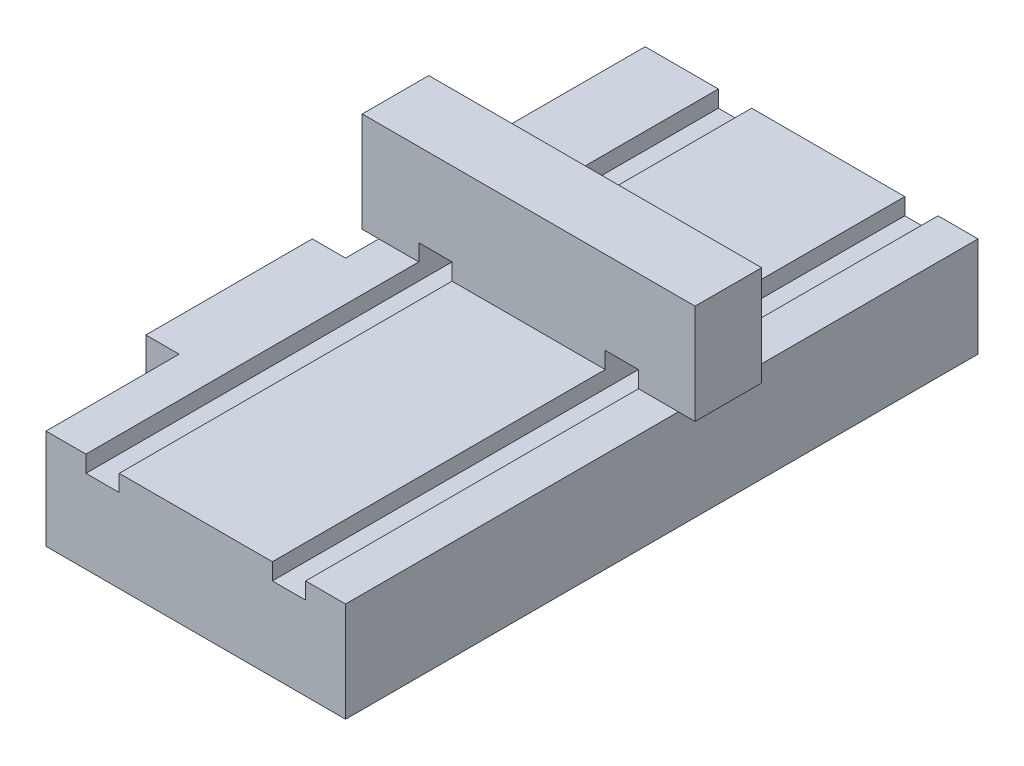
ISO-10303-21;
HEADER;
FILE_DESCRIPTION(('STEP AP214'),'2;1');
FILE_NAME('part.step','',(''),(''),'','','');
FILE_SCHEMA(('AUTOMOTIVE_DESIGN { 1 0 10303 214 1 1 1 1 }'));
ENDSEC;
DATA;
#1=APPLICATION_CONTEXT('core data for automotive mechanical design processes');
#2=APPLICATION_PROTOCOL_DEFINITION('international standard','automotive_design',2000,#1);
#3=PRODUCT_CONTEXT('',#1,'mechanical');
#4=PRODUCT('Part','Part','',(#3));
#5=PRODUCT_RELATED_PRODUCT_CATEGORY('part','',(#4));
#6=PRODUCT_DEFINITION_FORMATION('','',#4);
#7=PRODUCT_DEFINITION_CONTEXT('part definition',#1,'design');
#8=PRODUCT_DEFINITION('design','',#6,#7);
#9=PRODUCT_DEFINITION_SHAPE('','',#8);
#10=(LENGTH_UNIT() NAMED_UNIT(*) SI_UNIT(.MILLI.,.METRE.));
#11=(NAMED_UNIT(*) PLANE_ANGLE_UNIT() SI_UNIT($,.RADIAN.));
#12=(NAMED_UNIT(*) SI_UNIT($,.STERADIAN.) SOLID_ANGLE_UNIT());
#13=UNCERTAINTY_MEASURE_WITH_UNIT(LENGTH_MEASURE(1.E-05),#10,'distance_accuracy_value','');
#14=(GEOMETRIC_REPRESENTATION_CONTEXT(3) GLOBAL_UNCERTAINTY_ASSIGNED_CONTEXT((#13)) GLOBAL_UNIT_ASSIGNED_CONTEXT((#10,
#11,#12)) REPRESENTATION_CONTEXT('',''));
#15=CARTESIAN_POINT('',(0.,0.,0.));
#16=DIRECTION('',(0.,0.,1.));
#17=DIRECTION('',(1.,0.,0.));
#18=AXIS2_PLACEMENT_3D('',#15,#16,#17);
#19=CARTESIAN_POINT('',(100.,30.,0.));
#20=DIRECTION('',(-1.,0.,0.));
#21=DIRECTION('',(0.,0.,1.));
#22=AXIS2_PLACEMENT_3D('',#19,#20,#21);
#23=PLANE('',#22);
#24=DIRECTION('',(0.,0.,-1.));
#25=VECTOR('',#24,1.);
#26=CARTESIAN_POINT('',(100.,30.,-100.));
#27=LINE('',#26,#25);
#28=CARTESIAN_POINT('',(100.,30.,-100.));
#29=VERTEX_POINT('',#28);
#30=CARTESIAN_POINT('',(100.,30.,-120.));
#31=VERTEX_POINT('',#30);
#32=EDGE_CURVE('E71',#29,#31,#27,.T.);
#33=ORIENTED_EDGE('',*,*,#32,.F.);
#34=DIRECTION('',(0.,0.,-1.));
#35=VECTOR('',#34,1.);
#36=CARTESIAN_POINT('',(100.,30.,0.));
#37=LINE('',#36,#35);
#38=CARTESIAN_POINT('',(100.,30.,0.));
#39=VERTEX_POINT('',#38);
#40=EDGE_CURVE('E474',#39,#29,#37,.T.);
#41=ORIENTED_EDGE('',*,*,#40,.F.);
#42=DIRECTION('',(0.,-1.,0.));
#43=VECTOR('',#42,1.);
#44=CARTESIAN_POINT('',(100.,30.,0.));
#45=LINE('',#44,#43);
#46=CARTESIAN_POINT('',(100.,0.,0.));
#47=VERTEX_POINT('',#46);
#48=EDGE_CURVE('E568',#39,#47,#45,.T.);
#49=ORIENTED_EDGE('',*,*,#48,.T.);
#50=DIRECTION('',(0.,0.,-1.));
#51=VECTOR('',#50,1.);
#52=CARTESIAN_POINT('',(100.,0.,0.));
#53=LINE('',#52,#51);
#54=CARTESIAN_POINT('',(100.,0.,-190.));
#55=VERTEX_POINT('',#54);
#56=EDGE_CURVE('E514',#47,#55,#53,.T.);
#57=ORIENTED_EDGE('',*,*,#56,.T.);
#58=DIRECTION('',(0.,-1.,0.));
#59=VECTOR('',#58,1.);
#60=CARTESIAN_POINT('',(100.,30.,-190.));
#61=LINE('',#60,#59);
#62=CARTESIAN_POINT('',(100.,30.,-190.));
#63=VERTEX_POINT('',#62);
#64=EDGE_CURVE('E49',#63,#55,#61,.T.);
#65=ORIENTED_EDGE('',*,*,#64,.F.);
#66=EDGE_CURVE('E471',#31,#63,#37,.T.);
#67=ORIENTED_EDGE('',*,*,#66,.F.);
#68=EDGE_LOOP('',(#33,#41,#49,#57,#65,#67));
#69=FACE_BOUND('',#68,.T.);
#70=ADVANCED_FACE('F45',(#69),#23,.F.);
#71=CARTESIAN_POINT('',(10.,30.,-90.));
#72=DIRECTION('',(-1.,0.,0.));
#73=DIRECTION('',(0.,0.,1.));
#74=AXIS2_PLACEMENT_3D('',#71,#72,#73);
#75=PLANE('',#74);
#76=DIRECTION('',(0.,0.,-1.));
#77=VECTOR('',#76,1.);
#78=CARTESIAN_POINT('',(10.,30.,-90.));
#79=LINE('',#78,#77);
#80=CARTESIAN_POINT('',(10.,30.,-90.));
#81=VERTEX_POINT('',#80);
#82=CARTESIAN_POINT('',(10.,30.,-100.));
#83=VERTEX_POINT('',#82);
#84=EDGE_CURVE('E500',#81,#83,#79,.T.);
#85=ORIENTED_EDGE('',*,*,#84,.T.);
#86=DIRECTION('',(0.,0.,1.));
#87=VECTOR('',#86,1.);
#88=CARTESIAN_POINT('',(10.,30.,-120.));
#89=LINE('',#88,#87);
#90=CARTESIAN_POINT('',(10.,30.,-120.));
#91=VERTEX_POINT('',#90);
#92=EDGE_CURVE('E287',#91,#83,#89,.T.);
#93=ORIENTED_EDGE('',*,*,#92,.F.);
#94=CARTESIAN_POINT('',(10.,30.,-140.));
#95=VERTEX_POINT('',#94);
#96=EDGE_CURVE('E499',#91,#95,#79,.T.);
#97=ORIENTED_EDGE('',*,*,#96,.T.);
#98=DIRECTION('',(0.,-1.,0.));
#99=VECTOR('',#98,1.);
#100=CARTESIAN_POINT('',(10.,30.,-140.));
#101=LINE('',#100,#99);
#102=CARTESIAN_POINT('',(10.,0.,-140.));
#103=VERTEX_POINT('',#102);
#104=EDGE_CURVE('E551',#95,#103,#101,.T.);
#105=ORIENTED_EDGE('',*,*,#104,.T.);
#106=DIRECTION('',(0.,0.,-1.));
#107=VECTOR('',#106,1.);
#108=CARTESIAN_POINT('',(10.,0.,-90.));
#109=LINE('',#108,#107);
#110=CARTESIAN_POINT('',(10.,0.,-90.));
#111=VERTEX_POINT('',#110);
#112=EDGE_CURVE('E537',#111,#103,#109,.T.);
#113=ORIENTED_EDGE('',*,*,#112,.F.);
#114=DIRECTION('',(0.,-1.,0.));
#115=VECTOR('',#114,1.);
#116=CARTESIAN_POINT('',(10.,30.,-90.));
#117=LINE('',#116,#115);
#118=EDGE_CURVE('E554',#81,#111,#117,.T.);
#119=ORIENTED_EDGE('',*,*,#118,.F.);
#120=EDGE_LOOP('',(#85,#93,#97,#105,#113,#119));
#121=FACE_BOUND('',#120,.T.);
#122=ADVANCED_FACE('F645',(#121),#75,.T.);
#123=CARTESIAN_POINT('',(0.,30.,0.));
#124=DIRECTION('',(0.,1.,0.));
#125=DIRECTION('',(0.,0.,1.));
#126=AXIS2_PLACEMENT_3D('',#123,#124,#125);
#127=PLANE('',#126);
#128=DIRECTION('',(0.,0.,1.));
#129=VECTOR('',#128,1.);
#130=CARTESIAN_POINT('',(88.,30.,0.));
#131=LINE('',#130,#129);
#132=CARTESIAN_POINT('',(88.,30.,-190.));
#133=VERTEX_POINT('',#132);
#134=CARTESIAN_POINT('',(88.,30.,-120.));
#135=VERTEX_POINT('',#134);
#136=EDGE_CURVE('E406',#133,#135,#131,.T.);
#137=ORIENTED_EDGE('',*,*,#136,.T.);
#138=DIRECTION('',(-1.,0.,0.));
#139=VECTOR('',#138,1.);
#140=CARTESIAN_POINT('',(100.,30.,-120.));
#141=LINE('',#140,#139);
#142=EDGE_CURVE('E321',#31,#135,#141,.T.);
#143=ORIENTED_EDGE('',*,*,#142,.F.);
#144=ORIENTED_EDGE('',*,*,#66,.T.);
#145=DIRECTION('',(1.,0.,0.));
#146=VECTOR('',#145,1.);
#147=CARTESIAN_POINT('',(0.,30.,-190.));
#148=LINE('',#147,#146);
#149=EDGE_CURVE('E473',#133,#63,#148,.T.);
#150=ORIENTED_EDGE('',*,*,#149,.F.);
#151=EDGE_LOOP('',(#137,#143,#144,#150));
#152=FACE_BOUND('',#151,.T.);
#153=ADVANCED_FACE('F704',(#152),#127,.T.);
#154=ORIENTED_EDGE('',*,*,#40,.T.);
#155=DIRECTION('',(1.,0.,0.));
#156=VECTOR('',#155,1.);
#157=CARTESIAN_POINT('',(10.,30.,-100.));
#158=LINE('',#157,#156);
#159=CARTESIAN_POINT('',(88.,30.,-100.));
#160=VERTEX_POINT('',#159);
#161=EDGE_CURVE('E285',#160,#29,#158,.T.);
#162=ORIENTED_EDGE('',*,*,#161,.F.);
#163=CARTESIAN_POINT('',(88.,30.,0.));
#164=VERTEX_POINT('',#163);
#165=EDGE_CURVE('E379',#160,#164,#131,.T.);
#166=ORIENTED_EDGE('',*,*,#165,.T.);
#167=DIRECTION('',(1.,0.,0.));
#168=VECTOR('',#167,1.);
#169=CARTESIAN_POINT('',(10.,30.,0.));
#170=LINE('',#169,#168);
#171=EDGE_CURVE('E477',#164,#39,#170,.T.);
#172=ORIENTED_EDGE('',*,*,#171,.T.);
#173=EDGE_LOOP('',(#154,#162,#166,#172));
#174=FACE_BOUND('',#173,.T.);
#175=ADVANCED_FACE('F684',(#174),#127,.T.);
#176=DIRECTION('',(0.,0.,1.));
#177=VECTOR('',#176,1.);
#178=CARTESIAN_POINT('',(32.,30.,0.));
#179=LINE('',#178,#177);
#180=CARTESIAN_POINT('',(32.,30.,-190.));
#181=VERTEX_POINT('',#180);
#182=CARTESIAN_POINT('',(32.,30.,-120.));
#183=VERTEX_POINT('',#182);
#184=EDGE_CURVE('E444',#181,#183,#179,.T.);
#185=ORIENTED_EDGE('',*,*,#184,.T.);
#186=CARTESIAN_POINT('',(78.,30.,-120.));
#187=VERTEX_POINT('',#186);
#188=EDGE_CURVE('E388',#187,#183,#141,.T.);
#189=ORIENTED_EDGE('',*,*,#188,.F.);
#190=DIRECTION('',(0.,0.,1.));
#191=VECTOR('',#190,1.);
#192=CARTESIAN_POINT('',(78.,30.,0.));
#193=LINE('',#192,#191);
#194=CARTESIAN_POINT('',(78.,30.,-190.));
#195=VERTEX_POINT('',#194);
#196=EDGE_CURVE('E393',#195,#187,#193,.T.);
#197=ORIENTED_EDGE('',*,*,#196,.F.);
#198=EDGE_CURVE('E472',#181,#195,#148,.T.);
#199=ORIENTED_EDGE('',*,*,#198,.F.);
#200=EDGE_LOOP('',(#185,#189,#197,#199));
#201=FACE_BOUND('',#200,.T.);
#202=ADVANCED_FACE('F613',(#201),#127,.T.);
#203=CARTESIAN_POINT('',(78.,30.,-100.));
#204=VERTEX_POINT('',#203);
#205=CARTESIAN_POINT('',(78.,30.,0.));
#206=VERTEX_POINT('',#205);
#207=EDGE_CURVE('E409',#204,#206,#193,.T.);
#208=ORIENTED_EDGE('',*,*,#207,.F.);
#209=CARTESIAN_POINT('',(32.,30.,-100.));
#210=VERTEX_POINT('',#209);
#211=EDGE_CURVE('E383',#210,#204,#158,.T.);
#212=ORIENTED_EDGE('',*,*,#211,.F.);
#213=CARTESIAN_POINT('',(32.,30.,0.));
#214=VERTEX_POINT('',#213);
#215=EDGE_CURVE('E417',#210,#214,#179,.T.);
#216=ORIENTED_EDGE('',*,*,#215,.T.);
#217=EDGE_CURVE('E483',#214,#206,#170,.T.);
#218=ORIENTED_EDGE('',*,*,#217,.T.);
#219=EDGE_LOOP('',(#208,#212,#216,#218));
#220=FACE_BOUND('',#219,.T.);
#221=ADVANCED_FACE('F672',(#220),#127,.T.);
#222=ORIENTED_EDGE('',*,*,#96,.F.);
#223=CARTESIAN_POINT('',(22.,30.,-120.));
#224=VERTEX_POINT('',#223);
#225=EDGE_CURVE('E384',#224,#91,#141,.T.);
#226=ORIENTED_EDGE('',*,*,#225,.F.);
#227=DIRECTION('',(0.,0.,-1.));
#228=VECTOR('',#227,1.);
#229=CARTESIAN_POINT('',(22.,30.,0.));
#230=LINE('',#229,#228);
#231=CARTESIAN_POINT('',(22.,30.,-190.));
#232=VERTEX_POINT('',#231);
#233=EDGE_CURVE('E448',#224,#232,#230,.T.);
#234=ORIENTED_EDGE('',*,*,#233,.T.);
#235=CARTESIAN_POINT('',(0.,30.,-190.));
#236=VERTEX_POINT('',#235);
#237=EDGE_CURVE('E467',#236,#232,#148,.T.);
#238=ORIENTED_EDGE('',*,*,#237,.F.);
#239=DIRECTION('',(0.,0.,1.));
#240=VECTOR('',#239,1.);
#241=CARTESIAN_POINT('',(0.,30.,-190.));
#242=LINE('',#241,#240);
#243=CARTESIAN_POINT('',(0.,30.,-140.));
#244=VERTEX_POINT('',#243);
#245=EDGE_CURVE('E508',#236,#244,#242,.T.);
#246=ORIENTED_EDGE('',*,*,#245,.T.);
#247=DIRECTION('',(-1.,0.,0.));
#248=VECTOR('',#247,1.);
#249=CARTESIAN_POINT('',(10.,30.,-140.));
#250=LINE('',#249,#248);
#251=EDGE_CURVE('E504',#95,#244,#250,.T.);
#252=ORIENTED_EDGE('',*,*,#251,.F.);
#253=EDGE_LOOP('',(#222,#226,#234,#238,#246,#252));
#254=FACE_BOUND('',#253,.T.);
#255=ADVANCED_FACE('F594',(#254),#127,.T.);
#256=CARTESIAN_POINT('',(22.,30.,0.));
#257=VERTEX_POINT('',#256);
#258=CARTESIAN_POINT('',(22.,30.,-100.));
#259=VERTEX_POINT('',#258);
#260=EDGE_CURVE('E432',#257,#259,#230,.T.);
#261=ORIENTED_EDGE('',*,*,#260,.T.);
#262=EDGE_CURVE('E380',#83,#259,#158,.T.);
#263=ORIENTED_EDGE('',*,*,#262,.F.);
#264=ORIENTED_EDGE('',*,*,#84,.F.);
#265=DIRECTION('',(1.,0.,0.));
#266=VECTOR('',#265,1.);
#267=CARTESIAN_POINT('',(0.,30.,-90.));
#268=LINE('',#267,#266);
#269=CARTESIAN_POINT('',(0.,30.,-90.));
#270=VERTEX_POINT('',#269);
#271=EDGE_CURVE('E495',#270,#81,#268,.T.);
#272=ORIENTED_EDGE('',*,*,#271,.F.);
#273=DIRECTION('',(0.,0.,-1.));
#274=VECTOR('',#273,1.);
#275=CARTESIAN_POINT('',(0.,30.,-40.));
#276=LINE('',#275,#274);
#277=CARTESIAN_POINT('',(0.,30.,-40.));
#278=VERTEX_POINT('',#277);
#279=EDGE_CURVE('E491',#278,#270,#276,.T.);
#280=ORIENTED_EDGE('',*,*,#279,.F.);
#281=DIRECTION('',(-1.,0.,0.));
#282=VECTOR('',#281,1.);
#283=CARTESIAN_POINT('',(10.,30.,-40.));
#284=LINE('',#283,#282);
#285=CARTESIAN_POINT('',(10.,30.,-40.));
#286=VERTEX_POINT('',#285);
#287=EDGE_CURVE('E487',#286,#278,#284,.T.);
#288=ORIENTED_EDGE('',*,*,#287,.F.);
#289=DIRECTION('',(0.,0.,-1.));
#290=VECTOR('',#289,1.);
#291=CARTESIAN_POINT('',(10.,30.,0.));
#292=LINE('',#291,#290);
#293=CARTESIAN_POINT('',(10.,30.,0.));
#294=VERTEX_POINT('',#293);
#295=EDGE_CURVE('E482',#294,#286,#292,.T.);
#296=ORIENTED_EDGE('',*,*,#295,.F.);
#297=EDGE_CURVE('E478',#294,#257,#170,.T.);
#298=ORIENTED_EDGE('',*,*,#297,.T.);
#299=EDGE_LOOP('',(#261,#263,#264,#272,#280,#288,#296,#298));
#300=FACE_BOUND('',#299,.T.);
#301=ADVANCED_FACE('F641',(#300),#127,.T.);
#302=CARTESIAN_POINT('',(0.,30.,-190.));
#303=DIRECTION('',(0.,0.,-1.));
#304=DIRECTION('',(-1.,0.,0.));
#305=AXIS2_PLACEMENT_3D('',#302,#303,#304);
#306=PLANE('',#305);
#307=DIRECTION('',(-1.,0.,0.));
#308=VECTOR('',#307,1.);
#309=CARTESIAN_POINT('',(0.,25.,-190.));
#310=LINE('',#309,#308);
#311=CARTESIAN_POINT('',(88.,25.,-190.));
#312=VERTEX_POINT('',#311);
#313=CARTESIAN_POINT('',(78.,25.,-190.));
#314=VERTEX_POINT('',#313);
#315=EDGE_CURVE('E392',#312,#314,#310,.T.);
#316=ORIENTED_EDGE('',*,*,#315,.F.);
#317=DIRECTION('',(0.,1.,0.));
#318=VECTOR('',#317,1.);
#319=CARTESIAN_POINT('',(88.,25.,-190.));
#320=LINE('',#319,#318);
#321=EDGE_CURVE('E405',#312,#133,#320,.T.);
#322=ORIENTED_EDGE('',*,*,#321,.T.);
#323=ORIENTED_EDGE('',*,*,#149,.T.);
#324=ORIENTED_EDGE('',*,*,#64,.T.);
#325=DIRECTION('',(1.,0.,0.));
#326=VECTOR('',#325,1.);
#327=CARTESIAN_POINT('',(0.,0.,-190.));
#328=LINE('',#327,#326);
#329=CARTESIAN_POINT('',(0.,0.,-190.));
#330=VERTEX_POINT('',#329);
#331=EDGE_CURVE('E455',#330,#55,#328,.T.);
#332=ORIENTED_EDGE('',*,*,#331,.F.);
#333=DIRECTION('',(0.,-1.,0.));
#334=VECTOR('',#333,1.);
#335=CARTESIAN_POINT('',(0.,30.,-190.));
#336=LINE('',#335,#334);
#337=EDGE_CURVE('E11',#236,#330,#336,.T.);
#338=ORIENTED_EDGE('',*,*,#337,.F.);
#339=ORIENTED_EDGE('',*,*,#237,.T.);
#340=DIRECTION('',(0.,1.,0.));
#341=VECTOR('',#340,1.);
#342=CARTESIAN_POINT('',(22.,25.,-190.));
#343=LINE('',#342,#341);
#344=CARTESIAN_POINT('',(22.,25.,-190.));
#345=VERTEX_POINT('',#344);
#346=EDGE_CURVE('E460',#345,#232,#343,.T.);
#347=ORIENTED_EDGE('',*,*,#346,.F.);
#348=DIRECTION('',(-1.,0.,0.));
#349=VECTOR('',#348,1.);
#350=CARTESIAN_POINT('',(0.,25.,-190.));
#351=LINE('',#350,#349);
#352=CARTESIAN_POINT('',(32.,25.,-190.));
#353=VERTEX_POINT('',#352);
#354=EDGE_CURVE('E431',#353,#345,#351,.T.);
#355=ORIENTED_EDGE('',*,*,#354,.F.);
#356=DIRECTION('',(0.,1.,0.));
#357=VECTOR('',#356,1.);
#358=CARTESIAN_POINT('',(32.,25.,-190.));
#359=LINE('',#358,#357);
#360=EDGE_CURVE('E443',#353,#181,#359,.T.);
#361=ORIENTED_EDGE('',*,*,#360,.T.);
#362=ORIENTED_EDGE('',*,*,#198,.T.);
#363=DIRECTION('',(0.,1.,0.));
#364=VECTOR('',#363,1.);
#365=CARTESIAN_POINT('',(78.,25.,-190.));
#366=LINE('',#365,#364);
#367=EDGE_CURVE('E422',#314,#195,#366,.T.);
#368=ORIENTED_EDGE('',*,*,#367,.F.);
#369=EDGE_LOOP('',(#316,#322,#323,#324,#332,#338,#339,#347,#355,#361,#362,#368));
#370=FACE_BOUND('',#369,.T.);
#371=ADVANCED_FACE('F47',(#370),#306,.T.);
#372=CARTESIAN_POINT('',(10.,30.,0.));
#373=DIRECTION('',(0.,0.,-1.));
#374=DIRECTION('',(-1.,0.,0.));
#375=AXIS2_PLACEMENT_3D('',#372,#373,#374);
#376=PLANE('',#375);
#377=DIRECTION('',(0.,1.,0.));
#378=VECTOR('',#377,1.);
#379=CARTESIAN_POINT('',(88.,25.,0.));
#380=LINE('',#379,#378);
#381=CARTESIAN_POINT('',(88.,25.,0.));
#382=VERTEX_POINT('',#381);
#383=EDGE_CURVE('E413',#382,#164,#380,.T.);
#384=ORIENTED_EDGE('',*,*,#383,.F.);
#385=DIRECTION('',(1.,0.,0.));
#386=VECTOR('',#385,1.);
#387=CARTESIAN_POINT('',(0.,25.,0.));
#388=LINE('',#387,#386);
#389=CARTESIAN_POINT('',(78.,25.,0.));
#390=VERTEX_POINT('',#389);
#391=EDGE_CURVE('E401',#390,#382,#388,.T.);
#392=ORIENTED_EDGE('',*,*,#391,.F.);
#393=DIRECTION('',(0.,1.,0.));
#394=VECTOR('',#393,1.);
#395=CARTESIAN_POINT('',(78.,25.,0.));
#396=LINE('',#395,#394);
#397=EDGE_CURVE('E418',#390,#206,#396,.T.);
#398=ORIENTED_EDGE('',*,*,#397,.T.);
#399=ORIENTED_EDGE('',*,*,#217,.F.);
#400=DIRECTION('',(0.,1.,0.));
#401=VECTOR('',#400,1.);
#402=CARTESIAN_POINT('',(32.,25.,0.));
#403=LINE('',#402,#401);
#404=CARTESIAN_POINT('',(32.,25.,0.));
#405=VERTEX_POINT('',#404);
#406=EDGE_CURVE('E451',#405,#214,#403,.T.);
#407=ORIENTED_EDGE('',*,*,#406,.F.);
#408=DIRECTION('',(1.,0.,0.));
#409=VECTOR('',#408,1.);
#410=CARTESIAN_POINT('',(0.,25.,0.));
#411=LINE('',#410,#409);
#412=CARTESIAN_POINT('',(22.,25.,0.));
#413=VERTEX_POINT('',#412);
#414=EDGE_CURVE('E439',#413,#405,#411,.T.);
#415=ORIENTED_EDGE('',*,*,#414,.F.);
#416=DIRECTION('',(0.,1.,0.));
#417=VECTOR('',#416,1.);
#418=CARTESIAN_POINT('',(22.,25.,0.));
#419=LINE('',#418,#417);
#420=EDGE_CURVE('E456',#413,#257,#419,.T.);
#421=ORIENTED_EDGE('',*,*,#420,.T.);
#422=ORIENTED_EDGE('',*,*,#297,.F.);
#423=DIRECTION('',(0.,-1.,0.));
#424=VECTOR('',#423,1.);
#425=CARTESIAN_POINT('',(10.,30.,0.));
#426=LINE('',#425,#424);
#427=CARTESIAN_POINT('',(10.,0.,0.));
#428=VERTEX_POINT('',#427);
#429=EDGE_CURVE('E566',#294,#428,#426,.T.);
#430=ORIENTED_EDGE('',*,*,#429,.T.);
#431=DIRECTION('',(1.,0.,0.));
#432=VECTOR('',#431,1.);
#433=CARTESIAN_POINT('',(10.,0.,0.));
#434=LINE('',#433,#432);
#435=EDGE_CURVE('E518',#428,#47,#434,.T.);
#436=ORIENTED_EDGE('',*,*,#435,.T.);
#437=ORIENTED_EDGE('',*,*,#48,.F.);
#438=ORIENTED_EDGE('',*,*,#171,.F.);
#439=EDGE_LOOP('',(#384,#392,#398,#399,#407,#415,#421,#422,#430,#436,#437,#438));
#440=FACE_BOUND('',#439,.T.);
#441=ADVANCED_FACE('F665',(#440),#376,.F.);
#442=CARTESIAN_POINT('',(0.,30.,-190.));
#443=DIRECTION('',(1.,0.,0.));
#444=DIRECTION('',(0.,0.,-1.));
#445=AXIS2_PLACEMENT_3D('',#442,#443,#444);
#446=PLANE('',#445);
#447=DIRECTION('',(0.,0.,1.));
#448=VECTOR('',#447,1.);
#449=CARTESIAN_POINT('',(0.,0.,-190.));
#450=LINE('',#449,#448);
#451=CARTESIAN_POINT('',(0.,0.,-140.));
#452=VERTEX_POINT('',#451);
#453=EDGE_CURVE('E545',#330,#452,#450,.T.);
#454=ORIENTED_EDGE('',*,*,#453,.T.);
#455=DIRECTION('',(0.,-1.,0.));
#456=VECTOR('',#455,1.);
#457=CARTESIAN_POINT('',(0.,30.,-140.));
#458=LINE('',#457,#456);
#459=EDGE_CURVE('E55',#244,#452,#458,.T.);
#460=ORIENTED_EDGE('',*,*,#459,.F.);
#461=ORIENTED_EDGE('',*,*,#245,.F.);
#462=ORIENTED_EDGE('',*,*,#337,.T.);
#463=EDGE_LOOP('',(#454,#460,#461,#462));
#464=FACE_BOUND('',#463,.T.);
#465=ADVANCED_FACE('F587',(#464),#446,.F.);
#466=CARTESIAN_POINT('',(10.,30.,-140.));
#467=DIRECTION('',(0.,0.,1.));
#468=DIRECTION('',(1.,0.,0.));
#469=AXIS2_PLACEMENT_3D('',#466,#467,#468);
#470=PLANE('',#469);
#471=DIRECTION('',(-1.,0.,0.));
#472=VECTOR('',#471,1.);
#473=CARTESIAN_POINT('',(10.,0.,-140.));
#474=LINE('',#473,#472);
#475=EDGE_CURVE('E541',#103,#452,#474,.T.);
#476=ORIENTED_EDGE('',*,*,#475,.F.);
#477=ORIENTED_EDGE('',*,*,#104,.F.);
#478=ORIENTED_EDGE('',*,*,#251,.T.);
#479=ORIENTED_EDGE('',*,*,#459,.T.);
#480=EDGE_LOOP('',(#476,#477,#478,#479));
#481=FACE_BOUND('',#480,.T.);
#482=ADVANCED_FACE('F690',(#481),#470,.T.);
#483=CARTESIAN_POINT('',(0.,30.,-90.));
#484=DIRECTION('',(0.,0.,-1.));
#485=DIRECTION('',(-1.,0.,0.));
#486=AXIS2_PLACEMENT_3D('',#483,#484,#485);
#487=PLANE('',#486);
#488=DIRECTION('',(1.,0.,0.));
#489=VECTOR('',#488,1.);
#490=CARTESIAN_POINT('',(0.,0.,-90.));
#491=LINE('',#490,#489);
#492=CARTESIAN_POINT('',(0.,0.,-90.));
#493=VERTEX_POINT('',#492);
#494=EDGE_CURVE('E533',#493,#111,#491,.T.);
#495=ORIENTED_EDGE('',*,*,#494,.F.);
#496=DIRECTION('',(0.,-1.,0.));
#497=VECTOR('',#496,1.);
#498=CARTESIAN_POINT('',(0.,30.,-90.));
#499=LINE('',#498,#497);
#500=EDGE_CURVE('E557',#270,#493,#499,.T.);
#501=ORIENTED_EDGE('',*,*,#500,.F.);
#502=ORIENTED_EDGE('',*,*,#271,.T.);
#503=ORIENTED_EDGE('',*,*,#118,.T.);
#504=EDGE_LOOP('',(#495,#501,#502,#503));
#505=FACE_BOUND('',#504,.T.);
#506=ADVANCED_FACE('F649',(#505),#487,.T.);
#507=CARTESIAN_POINT('',(0.,30.,-40.));
#508=DIRECTION('',(-1.,0.,0.));
#509=DIRECTION('',(0.,0.,1.));
#510=AXIS2_PLACEMENT_3D('',#507,#508,#509);
#511=PLANE('',#510);
#512=DIRECTION('',(0.,0.,-1.));
#513=VECTOR('',#512,1.);
#514=CARTESIAN_POINT('',(0.,0.,-40.));
#515=LINE('',#514,#513);
#516=CARTESIAN_POINT('',(0.,0.,-40.));
#517=VERTEX_POINT('',#516);
#518=EDGE_CURVE('E529',#517,#493,#515,.T.);
#519=ORIENTED_EDGE('',*,*,#518,.F.);
#520=DIRECTION('',(0.,-1.,0.));
#521=VECTOR('',#520,1.);
#522=CARTESIAN_POINT('',(0.,30.,-40.));
#523=LINE('',#522,#521);
#524=EDGE_CURVE('E560',#278,#517,#523,.T.);
#525=ORIENTED_EDGE('',*,*,#524,.F.);
#526=ORIENTED_EDGE('',*,*,#279,.T.);
#527=ORIENTED_EDGE('',*,*,#500,.T.);
#528=EDGE_LOOP('',(#519,#525,#526,#527));
#529=FACE_BOUND('',#528,.T.);
#530=ADVANCED_FACE('F654',(#529),#511,.T.);
#531=CARTESIAN_POINT('',(10.,30.,-40.));
#532=DIRECTION('',(0.,0.,1.));
#533=DIRECTION('',(1.,0.,0.));
#534=AXIS2_PLACEMENT_3D('',#531,#532,#533);
#535=PLANE('',#534);
#536=DIRECTION('',(-1.,0.,0.));
#537=VECTOR('',#536,1.);
#538=CARTESIAN_POINT('',(10.,0.,-40.));
#539=LINE('',#538,#537);
#540=CARTESIAN_POINT('',(10.,0.,-40.));
#541=VERTEX_POINT('',#540);
#542=EDGE_CURVE('E525',#541,#517,#539,.T.);
#543=ORIENTED_EDGE('',*,*,#542,.F.);
#544=DIRECTION('',(0.,-1.,0.));
#545=VECTOR('',#544,1.);
#546=CARTESIAN_POINT('',(10.,30.,-40.));
#547=LINE('',#546,#545);
#548=EDGE_CURVE('E563',#286,#541,#547,.T.);
#549=ORIENTED_EDGE('',*,*,#548,.F.);
#550=ORIENTED_EDGE('',*,*,#287,.T.);
#551=ORIENTED_EDGE('',*,*,#524,.T.);
#552=EDGE_LOOP('',(#543,#549,#550,#551));
#553=FACE_BOUND('',#552,.T.);
#554=ADVANCED_FACE('F657',(#553),#535,.T.);
#555=CARTESIAN_POINT('',(10.,30.,0.));
#556=DIRECTION('',(-1.,0.,0.));
#557=DIRECTION('',(0.,0.,1.));
#558=AXIS2_PLACEMENT_3D('',#555,#556,#557);
#559=PLANE('',#558);
#560=DIRECTION('',(0.,0.,-1.));
#561=VECTOR('',#560,1.);
#562=CARTESIAN_POINT('',(10.,0.,0.));
#563=LINE('',#562,#561);
#564=EDGE_CURVE('E521',#428,#541,#563,.T.);
#565=ORIENTED_EDGE('',*,*,#564,.F.);
#566=ORIENTED_EDGE('',*,*,#429,.F.);
#567=ORIENTED_EDGE('',*,*,#295,.T.);
#568=ORIENTED_EDGE('',*,*,#548,.T.);
#569=EDGE_LOOP('',(#565,#566,#567,#568));
#570=FACE_BOUND('',#569,.T.);
#571=ADVANCED_FACE('F661',(#570),#559,.T.);
#572=CARTESIAN_POINT('',(0.,0.,0.));
#573=DIRECTION('',(0.,1.,0.));
#574=DIRECTION('',(0.,0.,1.));
#575=AXIS2_PLACEMENT_3D('',#572,#573,#574);
#576=PLANE('',#575);
#577=ORIENTED_EDGE('',*,*,#331,.T.);
#578=ORIENTED_EDGE('',*,*,#56,.F.);
#579=ORIENTED_EDGE('',*,*,#435,.F.);
#580=ORIENTED_EDGE('',*,*,#564,.T.);
#581=ORIENTED_EDGE('',*,*,#542,.T.);
#582=ORIENTED_EDGE('',*,*,#518,.T.);
#583=ORIENTED_EDGE('',*,*,#494,.T.);
#584=ORIENTED_EDGE('',*,*,#112,.T.);
#585=ORIENTED_EDGE('',*,*,#475,.T.);
#586=ORIENTED_EDGE('',*,*,#453,.F.);
#587=EDGE_LOOP('',(#577,#578,#579,#580,#581,#582,#583,#584,#585,#586));
#588=FACE_BOUND('',#587,.T.);
#589=ADVANCED_FACE('F583',(#588),#576,.F.);
#590=CARTESIAN_POINT('',(32.,25.,0.));
#591=DIRECTION('',(-1.,0.,0.));
#592=DIRECTION('',(0.,0.,1.));
#593=AXIS2_PLACEMENT_3D('',#590,#591,#592);
#594=PLANE('',#593);
#595=ORIENTED_EDGE('',*,*,#406,.T.);
#596=ORIENTED_EDGE('',*,*,#215,.F.);
#597=DIRECTION('',(0.,-1.,0.));
#598=VECTOR('',#597,1.);
#599=CARTESIAN_POINT('',(32.,60.,-100.));
#600=LINE('',#599,#598);
#601=CARTESIAN_POINT('',(32.,35.,-100.));
#602=VERTEX_POINT('',#601);
#603=EDGE_CURVE('E354',#602,#210,#600,.T.);
#604=ORIENTED_EDGE('',*,*,#603,.F.);
#605=DIRECTION('',(0.,0.,-1.));
#606=VECTOR('',#605,1.);
#607=CARTESIAN_POINT('',(32.,35.,-83.9999999999999));
#608=LINE('',#607,#606);
#609=CARTESIAN_POINT('',(32.,35.,-120.));
#610=VERTEX_POINT('',#609);
#611=EDGE_CURVE('E361',#602,#610,#608,.T.);
#612=ORIENTED_EDGE('',*,*,#611,.T.);
#613=DIRECTION('',(0.,-1.,0.));
#614=VECTOR('',#613,1.);
#615=CARTESIAN_POINT('',(32.,35.,-120.));
#616=LINE('',#615,#614);
#617=EDGE_CURVE('E375',#610,#183,#616,.T.);
#618=ORIENTED_EDGE('',*,*,#617,.T.);
#619=ORIENTED_EDGE('',*,*,#184,.F.);
#620=ORIENTED_EDGE('',*,*,#360,.F.);
#621=DIRECTION('',(0.,0.,1.));
#622=VECTOR('',#621,1.);
#623=CARTESIAN_POINT('',(32.,25.,0.));
#624=LINE('',#623,#622);
#625=EDGE_CURVE('E428',#353,#405,#624,.T.);
#626=ORIENTED_EDGE('',*,*,#625,.T.);
#627=EDGE_LOOP('',(#595,#596,#604,#612,#618,#619,#620,#626));
#628=FACE_BOUND('',#627,.T.);
#629=ADVANCED_FACE('F630',(#628),#594,.T.);
#630=CARTESIAN_POINT('',(22.,25.,0.));
#631=DIRECTION('',(1.,0.,0.));
#632=DIRECTION('',(0.,0.,-1.));
#633=AXIS2_PLACEMENT_3D('',#630,#631,#632);
#634=PLANE('',#633);
#635=ORIENTED_EDGE('',*,*,#346,.T.);
#636=ORIENTED_EDGE('',*,*,#233,.F.);
#637=DIRECTION('',(0.,1.,0.));
#638=VECTOR('',#637,1.);
#639=CARTESIAN_POINT('',(22.,35.,-120.));
#640=LINE('',#639,#638);
#641=CARTESIAN_POINT('',(22.,35.,-120.));
#642=VERTEX_POINT('',#641);
#643=EDGE_CURVE('E371',#224,#642,#640,.T.);
#644=ORIENTED_EDGE('',*,*,#643,.T.);
#645=DIRECTION('',(0.,0.,-1.));
#646=VECTOR('',#645,1.);
#647=CARTESIAN_POINT('',(22.,35.,-83.9999999999999));
#648=LINE('',#647,#646);
#649=CARTESIAN_POINT('',(22.,35.,-100.));
#650=VERTEX_POINT('',#649);
#651=EDGE_CURVE('E362',#650,#642,#648,.T.);
#652=ORIENTED_EDGE('',*,*,#651,.F.);
#653=DIRECTION('',(0.,1.,0.));
#654=VECTOR('',#653,1.);
#655=CARTESIAN_POINT('',(22.,60.,-100.));
#656=LINE('',#655,#654);
#657=EDGE_CURVE('E357',#259,#650,#656,.T.);
#658=ORIENTED_EDGE('',*,*,#657,.F.);
#659=ORIENTED_EDGE('',*,*,#260,.F.);
#660=ORIENTED_EDGE('',*,*,#420,.F.);
#661=DIRECTION('',(0.,0.,-1.));
#662=VECTOR('',#661,1.);
#663=CARTESIAN_POINT('',(22.,25.,0.));
#664=LINE('',#663,#662);
#665=EDGE_CURVE('E436',#413,#345,#664,.T.);
#666=ORIENTED_EDGE('',*,*,#665,.T.);
#667=EDGE_LOOP('',(#635,#636,#644,#652,#658,#659,#660,#666));
#668=FACE_BOUND('',#667,.T.);
#669=ADVANCED_FACE('F601',(#668),#634,.T.);
#670=CARTESIAN_POINT('',(0.,25.,0.));
#671=DIRECTION('',(0.,1.,0.));
#672=DIRECTION('',(0.,0.,1.));
#673=AXIS2_PLACEMENT_3D('',#670,#671,#672);
#674=PLANE('',#673);
#675=ORIENTED_EDGE('',*,*,#625,.F.);
#676=ORIENTED_EDGE('',*,*,#354,.T.);
#677=ORIENTED_EDGE('',*,*,#665,.F.);
#678=ORIENTED_EDGE('',*,*,#414,.T.);
#679=EDGE_LOOP('',(#675,#676,#677,#678));
#680=FACE_BOUND('',#679,.T.);
#681=ADVANCED_FACE('F606',(#680),#674,.T.);
#682=CARTESIAN_POINT('',(88.,25.,0.));
#683=DIRECTION('',(-1.,0.,0.));
#684=DIRECTION('',(0.,0.,1.));
#685=AXIS2_PLACEMENT_3D('',#682,#683,#684);
#686=PLANE('',#685);
#687=ORIENTED_EDGE('',*,*,#383,.T.);
#688=ORIENTED_EDGE('',*,*,#165,.F.);
#689=DIRECTION('',(0.,-1.,0.));
#690=VECTOR('',#689,1.);
#691=CARTESIAN_POINT('',(88.,60.,-100.));
#692=LINE('',#691,#690);
#693=CARTESIAN_POINT('',(88.,35.,-100.));
#694=VERTEX_POINT('',#693);
#695=EDGE_CURVE('E322',#694,#160,#692,.T.);
#696=ORIENTED_EDGE('',*,*,#695,.F.);
#697=DIRECTION('',(0.,0.,-1.));
#698=VECTOR('',#697,1.);
#699=CARTESIAN_POINT('',(88.,35.,-86.));
#700=LINE('',#699,#698);
#701=CARTESIAN_POINT('',(88.,35.,-120.));
#702=VERTEX_POINT('',#701);
#703=EDGE_CURVE('E333',#694,#702,#700,.T.);
#704=ORIENTED_EDGE('',*,*,#703,.T.);
#705=DIRECTION('',(0.,-1.,0.));
#706=VECTOR('',#705,1.);
#707=CARTESIAN_POINT('',(88.,35.,-120.));
#708=LINE('',#707,#706);
#709=EDGE_CURVE('E347',#702,#135,#708,.T.);
#710=ORIENTED_EDGE('',*,*,#709,.T.);
#711=ORIENTED_EDGE('',*,*,#136,.F.);
#712=ORIENTED_EDGE('',*,*,#321,.F.);
#713=DIRECTION('',(0.,0.,1.));
#714=VECTOR('',#713,1.);
#715=CARTESIAN_POINT('',(88.,25.,0.));
#716=LINE('',#715,#714);
#717=EDGE_CURVE('E389',#312,#382,#716,.T.);
#718=ORIENTED_EDGE('',*,*,#717,.T.);
#719=EDGE_LOOP('',(#687,#688,#696,#704,#710,#711,#712,#718));
#720=FACE_BOUND('',#719,.T.);
#721=ADVANCED_FACE('F681',(#720),#686,.T.);
#722=CARTESIAN_POINT('',(78.,25.,0.));
#723=DIRECTION('',(-1.,0.,0.));
#724=DIRECTION('',(0.,0.,1.));
#725=AXIS2_PLACEMENT_3D('',#722,#723,#724);
#726=PLANE('',#725);
#727=ORIENTED_EDGE('',*,*,#196,.T.);
#728=DIRECTION('',(0.,1.,0.));
#729=VECTOR('',#728,1.);
#730=CARTESIAN_POINT('',(78.,35.,-120.));
#731=LINE('',#730,#729);
#732=CARTESIAN_POINT('',(78.,35.,-120.));
#733=VERTEX_POINT('',#732);
#734=EDGE_CURVE('E343',#187,#733,#731,.T.);
#735=ORIENTED_EDGE('',*,*,#734,.T.);
#736=DIRECTION('',(0.,0.,-1.));
#737=VECTOR('',#736,1.);
#738=CARTESIAN_POINT('',(78.,35.,-86.));
#739=LINE('',#738,#737);
#740=CARTESIAN_POINT('',(78.,35.,-100.));
#741=VERTEX_POINT('',#740);
#742=EDGE_CURVE('E334',#741,#733,#739,.T.);
#743=ORIENTED_EDGE('',*,*,#742,.F.);
#744=DIRECTION('',(0.,1.,0.));
#745=VECTOR('',#744,1.);
#746=CARTESIAN_POINT('',(78.,60.,-100.));
#747=LINE('',#746,#745);
#748=EDGE_CURVE('E329',#204,#741,#747,.T.);
#749=ORIENTED_EDGE('',*,*,#748,.F.);
#750=ORIENTED_EDGE('',*,*,#207,.T.);
#751=ORIENTED_EDGE('',*,*,#397,.F.);
#752=DIRECTION('',(0.,0.,1.));
#753=VECTOR('',#752,1.);
#754=CARTESIAN_POINT('',(78.,25.,0.));
#755=LINE('',#754,#753);
#756=EDGE_CURVE('E397',#314,#390,#755,.T.);
#757=ORIENTED_EDGE('',*,*,#756,.F.);
#758=ORIENTED_EDGE('',*,*,#367,.T.);
#759=EDGE_LOOP('',(#727,#735,#743,#749,#750,#751,#757,#758));
#760=FACE_BOUND('',#759,.T.);
#761=ADVANCED_FACE('F675',(#760),#726,.F.);
#762=CARTESIAN_POINT('',(0.,25.,0.));
#763=DIRECTION('',(0.,1.,0.));
#764=DIRECTION('',(0.,0.,1.));
#765=AXIS2_PLACEMENT_3D('',#762,#763,#764);
#766=PLANE('',#765);
#767=ORIENTED_EDGE('',*,*,#717,.F.);
#768=ORIENTED_EDGE('',*,*,#315,.T.);
#769=ORIENTED_EDGE('',*,*,#756,.T.);
#770=ORIENTED_EDGE('',*,*,#391,.T.);
#771=EDGE_LOOP('',(#767,#768,#769,#770));
#772=FACE_BOUND('',#771,.T.);
#773=ADVANCED_FACE('F765',(#772),#766,.T.);
#774=CARTESIAN_POINT('',(88.,35.,-86.));
#775=DIRECTION('',(0.,1.,0.));
#776=DIRECTION('',(0.,0.,1.));
#777=AXIS2_PLACEMENT_3D('',#774,#775,#776);
#778=PLANE('',#777);
#779=ORIENTED_EDGE('',*,*,#742,.T.);
#780=DIRECTION('',(1.,0.,0.));
#781=VECTOR('',#780,1.);
#782=CARTESIAN_POINT('',(88.,35.,-120.));
#783=LINE('',#782,#781);
#784=EDGE_CURVE('E337',#733,#702,#783,.T.);
#785=ORIENTED_EDGE('',*,*,#784,.T.);
#786=ORIENTED_EDGE('',*,*,#703,.F.);
#787=DIRECTION('',(1.,0.,0.));
#788=VECTOR('',#787,1.);
#789=CARTESIAN_POINT('',(10.,35.,-100.));
#790=LINE('',#789,#788);
#791=EDGE_CURVE('E325',#741,#694,#790,.T.);
#792=ORIENTED_EDGE('',*,*,#791,.F.);
#793=EDGE_LOOP('',(#779,#785,#786,#792));
#794=FACE_BOUND('',#793,.T.);
#795=ADVANCED_FACE('F677',(#794),#778,.F.);
#796=CARTESIAN_POINT('',(0.,60.,0.));
#797=DIRECTION('',(0.,1.,0.));
#798=DIRECTION('',(0.,0.,1.));
#799=AXIS2_PLACEMENT_3D('',#796,#797,#798);
#800=PLANE('',#799);
#801=DIRECTION('',(-1.,0.,0.));
#802=VECTOR('',#801,1.);
#803=CARTESIAN_POINT('',(100.,60.,-120.));
#804=LINE('',#803,#802);
#805=CARTESIAN_POINT('',(105.,60.,-120.));
#806=VERTEX_POINT('',#805);
#807=CARTESIAN_POINT('',(4.99999999999998,60.,-120.));
#808=VERTEX_POINT('',#807);
#809=EDGE_CURVE('E315',#806,#808,#804,.T.);
#810=ORIENTED_EDGE('',*,*,#809,.T.);
#811=DIRECTION('',(0.,0.,-1.));
#812=VECTOR('',#811,1.);
#813=CARTESIAN_POINT('',(4.99999999999998,60.,-120.));
#814=LINE('',#813,#812);
#815=CARTESIAN_POINT('',(4.99999999999998,60.,-100.));
#816=VERTEX_POINT('',#815);
#817=EDGE_CURVE('E306',#816,#808,#814,.T.);
#818=ORIENTED_EDGE('',*,*,#817,.F.);
#819=DIRECTION('',(1.,0.,0.));
#820=VECTOR('',#819,1.);
#821=CARTESIAN_POINT('',(10.,60.,-100.));
#822=LINE('',#821,#820);
#823=CARTESIAN_POINT('',(105.,60.,-100.));
#824=VERTEX_POINT('',#823);
#825=EDGE_CURVE('E318',#816,#824,#822,.T.);
#826=ORIENTED_EDGE('',*,*,#825,.T.);
#827=DIRECTION('',(0.,0.,1.));
#828=VECTOR('',#827,1.);
#829=CARTESIAN_POINT('',(105.,60.,-100.));
#830=LINE('',#829,#828);
#831=EDGE_CURVE('E277',#806,#824,#830,.T.);
#832=ORIENTED_EDGE('',*,*,#831,.F.);
#833=EDGE_LOOP('',(#810,#818,#826,#832));
#834=FACE_BOUND('',#833,.T.);
#835=ADVANCED_FACE('F780',(#834),#800,.T.);
#836=CARTESIAN_POINT('',(32.,35.,-83.9999999999999));
#837=DIRECTION('',(0.,1.,0.));
#838=DIRECTION('',(0.,0.,1.));
#839=AXIS2_PLACEMENT_3D('',#836,#837,#838);
#840=PLANE('',#839);
#841=ORIENTED_EDGE('',*,*,#651,.T.);
#842=DIRECTION('',(1.,0.,0.));
#843=VECTOR('',#842,1.);
#844=CARTESIAN_POINT('',(32.,35.,-120.));
#845=LINE('',#844,#843);
#846=EDGE_CURVE('E365',#642,#610,#845,.T.);
#847=ORIENTED_EDGE('',*,*,#846,.T.);
#848=ORIENTED_EDGE('',*,*,#611,.F.);
#849=DIRECTION('',(1.,0.,0.));
#850=VECTOR('',#849,1.);
#851=CARTESIAN_POINT('',(10.,35.,-100.));
#852=LINE('',#851,#850);
#853=EDGE_CURVE('E351',#650,#602,#852,.T.);
#854=ORIENTED_EDGE('',*,*,#853,.F.);
#855=EDGE_LOOP('',(#841,#847,#848,#854));
#856=FACE_BOUND('',#855,.T.);
#857=ADVANCED_FACE('F634',(#856),#840,.F.);
#858=CARTESIAN_POINT('',(100.,60.,-120.));
#859=DIRECTION('',(0.,0.,1.));
#860=DIRECTION('',(1.,0.,0.));
#861=AXIS2_PLACEMENT_3D('',#858,#859,#860);
#862=PLANE('',#861);
#863=ORIENTED_EDGE('',*,*,#188,.T.);
#864=ORIENTED_EDGE('',*,*,#617,.F.);
#865=ORIENTED_EDGE('',*,*,#846,.F.);
#866=ORIENTED_EDGE('',*,*,#643,.F.);
#867=ORIENTED_EDGE('',*,*,#225,.T.);
#868=DIRECTION('',(1.,0.,0.));
#869=VECTOR('',#868,1.);
#870=CARTESIAN_POINT('',(4.99999999999998,30.,-120.));
#871=LINE('',#870,#869);
#872=CARTESIAN_POINT('',(4.99999999999998,30.,-120.));
#873=VERTEX_POINT('',#872);
#874=EDGE_CURVE('E312',#873,#91,#871,.T.);
#875=ORIENTED_EDGE('',*,*,#874,.F.);
#876=DIRECTION('',(0.,-1.,0.));
#877=VECTOR('',#876,1.);
#878=CARTESIAN_POINT('',(4.99999999999998,60.,-120.));
#879=LINE('',#878,#877);
#880=EDGE_CURVE('E291',#808,#873,#879,.T.);
#881=ORIENTED_EDGE('',*,*,#880,.F.);
#882=ORIENTED_EDGE('',*,*,#809,.F.);
#883=DIRECTION('',(0.,1.,0.));
#884=VECTOR('',#883,1.);
#885=CARTESIAN_POINT('',(105.,60.,-120.));
#886=LINE('',#885,#884);
#887=CARTESIAN_POINT('',(105.,30.,-120.));
#888=VERTEX_POINT('',#887);
#889=EDGE_CURVE('E270',#888,#806,#886,.T.);
#890=ORIENTED_EDGE('',*,*,#889,.F.);
#891=DIRECTION('',(-1.,0.,0.));
#892=VECTOR('',#891,1.);
#893=CARTESIAN_POINT('',(105.,30.,-120.));
#894=LINE('',#893,#892);
#895=EDGE_CURVE('E265',#888,#31,#894,.T.);
#896=ORIENTED_EDGE('',*,*,#895,.T.);
#897=ORIENTED_EDGE('',*,*,#142,.T.);
#898=ORIENTED_EDGE('',*,*,#709,.F.);
#899=ORIENTED_EDGE('',*,*,#784,.F.);
#900=ORIENTED_EDGE('',*,*,#734,.F.);
#901=EDGE_LOOP('',(#863,#864,#865,#866,#867,#875,#881,#882,#890,#896,#897,#898,#899,#900));
#902=FACE_BOUND('',#901,.T.);
#903=ADVANCED_FACE('F627',(#902),#862,.F.);
#904=CARTESIAN_POINT('',(10.,60.,-100.));
#905=DIRECTION('',(0.,0.,-1.));
#906=DIRECTION('',(-1.,0.,0.));
#907=AXIS2_PLACEMENT_3D('',#904,#905,#906);
#908=PLANE('',#907);
#909=ORIENTED_EDGE('',*,*,#853,.T.);
#910=ORIENTED_EDGE('',*,*,#603,.T.);
#911=ORIENTED_EDGE('',*,*,#211,.T.);
#912=ORIENTED_EDGE('',*,*,#748,.T.);
#913=ORIENTED_EDGE('',*,*,#791,.T.);
#914=ORIENTED_EDGE('',*,*,#695,.T.);
#915=ORIENTED_EDGE('',*,*,#161,.T.);
#916=DIRECTION('',(-1.,0.,0.));
#917=VECTOR('',#916,1.);
#918=CARTESIAN_POINT('',(105.,30.,-100.));
#919=LINE('',#918,#917);
#920=CARTESIAN_POINT('',(105.,30.,-100.));
#921=VERTEX_POINT('',#920);
#922=EDGE_CURVE('E263',#921,#29,#919,.T.);
#923=ORIENTED_EDGE('',*,*,#922,.F.);
#924=DIRECTION('',(0.,-1.,0.));
#925=VECTOR('',#924,1.);
#926=CARTESIAN_POINT('',(105.,60.,-100.));
#927=LINE('',#926,#925);
#928=EDGE_CURVE('E271',#824,#921,#927,.T.);
#929=ORIENTED_EDGE('',*,*,#928,.F.);
#930=ORIENTED_EDGE('',*,*,#825,.F.);
#931=DIRECTION('',(0.,1.,0.));
#932=VECTOR('',#931,1.);
#933=CARTESIAN_POINT('',(4.99999999999998,60.,-100.));
#934=LINE('',#933,#932);
#935=CARTESIAN_POINT('',(4.99999999999998,30.,-100.));
#936=VERTEX_POINT('',#935);
#937=EDGE_CURVE('E302',#936,#816,#934,.T.);
#938=ORIENTED_EDGE('',*,*,#937,.F.);
#939=DIRECTION('',(1.,0.,0.));
#940=VECTOR('',#939,1.);
#941=CARTESIAN_POINT('',(4.99999999999998,30.,-100.));
#942=LINE('',#941,#940);
#943=EDGE_CURVE('E63',#936,#83,#942,.T.);
#944=ORIENTED_EDGE('',*,*,#943,.T.);
#945=ORIENTED_EDGE('',*,*,#262,.T.);
#946=ORIENTED_EDGE('',*,*,#657,.T.);
#947=EDGE_LOOP('',(#909,#910,#911,#912,#913,#914,#915,#923,#929,#930,#938,#944,#945,#946));
#948=FACE_BOUND('',#947,.T.);
#949=ADVANCED_FACE('F282',(#948),#908,.F.);
#950=CARTESIAN_POINT('',(4.99999999999998,30.,-120.));
#951=DIRECTION('',(0.,1.,0.));
#952=DIRECTION('',(0.,0.,1.));
#953=AXIS2_PLACEMENT_3D('',#950,#951,#952);
#954=PLANE('',#953);
#955=ORIENTED_EDGE('',*,*,#92,.T.);
#956=ORIENTED_EDGE('',*,*,#943,.F.);
#957=DIRECTION('',(0.,0.,1.));
#958=VECTOR('',#957,1.);
#959=CARTESIAN_POINT('',(4.99999999999998,30.,-120.));
#960=LINE('',#959,#958);
#961=EDGE_CURVE('E299',#873,#936,#960,.T.);
#962=ORIENTED_EDGE('',*,*,#961,.F.);
#963=ORIENTED_EDGE('',*,*,#874,.T.);
#964=EDGE_LOOP('',(#955,#956,#962,#963));
#965=FACE_BOUND('',#964,.T.);
#966=ADVANCED_FACE('F808',(#965),#954,.F.);
#967=CARTESIAN_POINT('',(4.99999999999998,0.,0.));
#968=DIRECTION('',(-1.,0.,0.));
#969=DIRECTION('',(0.,0.,1.));
#970=AXIS2_PLACEMENT_3D('',#967,#968,#969);
#971=PLANE('',#970);
#972=ORIENTED_EDGE('',*,*,#880,.T.);
#973=ORIENTED_EDGE('',*,*,#961,.T.);
#974=ORIENTED_EDGE('',*,*,#937,.T.);
#975=ORIENTED_EDGE('',*,*,#817,.T.);
#976=EDGE_LOOP('',(#972,#973,#974,#975));
#977=FACE_BOUND('',#976,.T.);
#978=ADVANCED_FACE('F815',(#977),#971,.T.);
#979=CARTESIAN_POINT('',(105.,30.,-100.));
#980=DIRECTION('',(0.,1.,0.));
#981=DIRECTION('',(0.,0.,1.));
#982=AXIS2_PLACEMENT_3D('',#979,#980,#981);
#983=PLANE('',#982);
#984=ORIENTED_EDGE('',*,*,#32,.T.);
#985=ORIENTED_EDGE('',*,*,#895,.F.);
#986=DIRECTION('',(0.,0.,-1.));
#987=VECTOR('',#986,1.);
#988=CARTESIAN_POINT('',(105.,30.,-100.));
#989=LINE('',#988,#987);
#990=EDGE_CURVE('E259',#921,#888,#989,.T.);
#991=ORIENTED_EDGE('',*,*,#990,.F.);
#992=ORIENTED_EDGE('',*,*,#922,.T.);
#993=EDGE_LOOP('',(#984,#985,#991,#992));
#994=FACE_BOUND('',#993,.T.);
#995=ADVANCED_FACE('F261',(#994),#983,.F.);
#996=CARTESIAN_POINT('',(105.,0.,0.));
#997=DIRECTION('',(1.,0.,0.));
#998=DIRECTION('',(0.,0.,-1.));
#999=AXIS2_PLACEMENT_3D('',#996,#997,#998);
#1000=PLANE('',#999);
#1001=ORIENTED_EDGE('',*,*,#928,.T.);
#1002=ORIENTED_EDGE('',*,*,#990,.T.);
#1003=ORIENTED_EDGE('',*,*,#889,.T.);
#1004=ORIENTED_EDGE('',*,*,#831,.T.);
#1005=EDGE_LOOP('',(#1001,#1002,#1003,#1004));
#1006=FACE_BOUND('',#1005,.T.);
#1007=ADVANCED_FACE('F275',(#1006),#1000,.T.);
#1008=CLOSED_SHELL('',(#70,#122,#153,#175,#202,#221,#255,#301,#371,#441,#465,#482,#506,#530,
#554,#571,#589,#629,#669,#681,#721,#761,#773,#795,#835,#857,#903,#949,#966,#978,#995,#1007));
#1009=MANIFOLD_SOLID_BREP('B2',#1008);
#1010=ADVANCED_BREP_SHAPE_REPRESENTATION('',(#18,#1009),#14);
#1011=SHAPE_DEFINITION_REPRESENTATION(#9,#1010);
ENDSEC;
END-ISO-10303-21;
